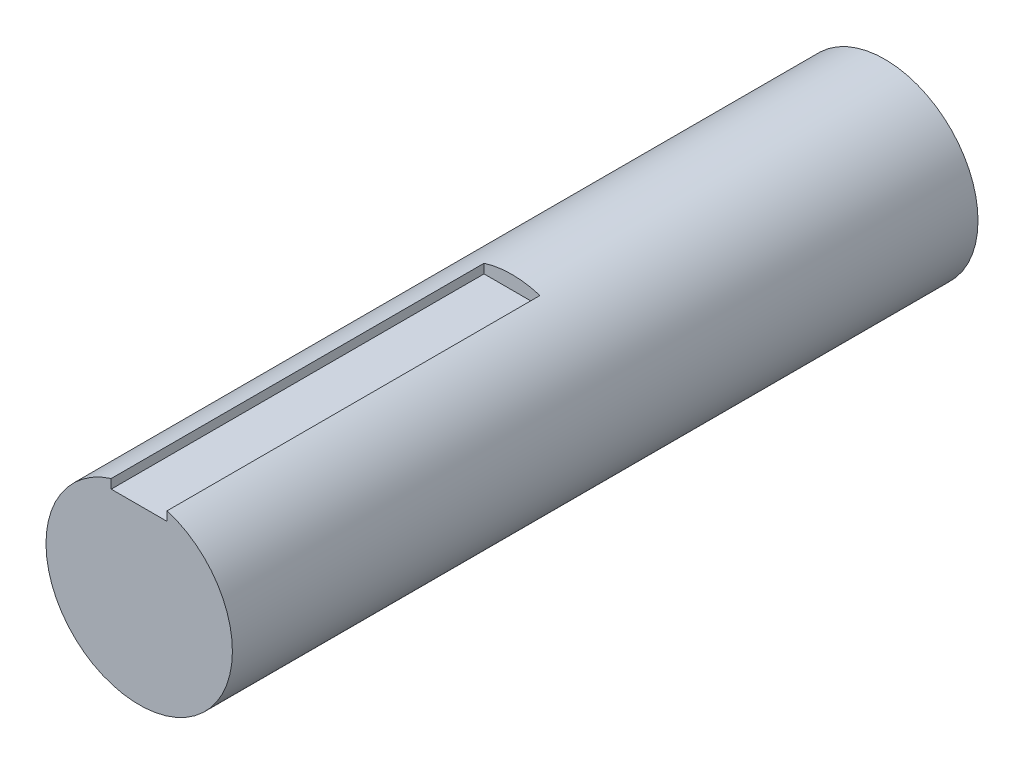
ISO-10303-21;
HEADER;
FILE_DESCRIPTION(('STEP AP214'),'2;1');
FILE_NAME('part.step','',(''),(''),'','','');
FILE_SCHEMA(('AUTOMOTIVE_DESIGN { 1 0 10303 214 1 1 1 1 }'));
ENDSEC;
DATA;
#1=APPLICATION_CONTEXT('core data for automotive mechanical design processes');
#2=APPLICATION_PROTOCOL_DEFINITION('international standard','automotive_design',2000,#1);
#3=PRODUCT_CONTEXT('',#1,'mechanical');
#4=PRODUCT('Part','Part','',(#3));
#5=PRODUCT_RELATED_PRODUCT_CATEGORY('part','',(#4));
#6=PRODUCT_DEFINITION_FORMATION('','',#4);
#7=PRODUCT_DEFINITION_CONTEXT('part definition',#1,'design');
#8=PRODUCT_DEFINITION('design','',#6,#7);
#9=PRODUCT_DEFINITION_SHAPE('','',#8);
#10=(LENGTH_UNIT() NAMED_UNIT(*) SI_UNIT(.MILLI.,.METRE.));
#11=(NAMED_UNIT(*) PLANE_ANGLE_UNIT() SI_UNIT($,.RADIAN.));
#12=(NAMED_UNIT(*) SI_UNIT($,.STERADIAN.) SOLID_ANGLE_UNIT());
#13=UNCERTAINTY_MEASURE_WITH_UNIT(LENGTH_MEASURE(1.E-05),#10,'distance_accuracy_value','');
#14=(GEOMETRIC_REPRESENTATION_CONTEXT(3) GLOBAL_UNCERTAINTY_ASSIGNED_CONTEXT((#13)) GLOBAL_UNIT_ASSIGNED_CONTEXT((#10,
#11,#12)) REPRESENTATION_CONTEXT('',''));
#15=CARTESIAN_POINT('',(0.,0.,0.));
#16=DIRECTION('',(0.,0.,1.));
#17=DIRECTION('',(1.,0.,0.));
#18=AXIS2_PLACEMENT_3D('',#15,#16,#17);
#19=CARTESIAN_POINT('',(0.,0.,20.));
#20=DIRECTION('',(0.,0.,-1.));
#21=DIRECTION('',(-1.,0.,0.));
#22=AXIS2_PLACEMENT_3D('',#19,#20,#21);
#23=CYLINDRICAL_SURFACE('',#22,2.5);
#24=CARTESIAN_POINT('',(0.,0.,20.));
#25=DIRECTION('',(0.,0.,1.));
#26=DIRECTION('',(1.,0.,0.));
#27=AXIS2_PLACEMENT_3D('',#24,#25,#26);
#28=CIRCLE('',#27,2.5);
#29=CARTESIAN_POINT('',(-0.75,2.38484800354236,20.));
#30=VERTEX_POINT('',#29);
#31=CARTESIAN_POINT('',(0.75,2.38484800354236,20.));
#32=VERTEX_POINT('',#31);
#33=EDGE_CURVE('E92',#30,#32,#28,.T.);
#34=ORIENTED_EDGE('',*,*,#33,.F.);
#35=DIRECTION('',(0.,0.,-1.));
#36=VECTOR('',#35,1.);
#37=CARTESIAN_POINT('',(-0.75,2.38484800354236,20.));
#38=LINE('',#37,#36);
#39=CARTESIAN_POINT('',(-0.75,2.38484800354236,10.));
#40=VERTEX_POINT('',#39);
#41=EDGE_CURVE('E102',#30,#40,#38,.T.);
#42=ORIENTED_EDGE('',*,*,#41,.T.);
#43=CARTESIAN_POINT('',(0.,0.,10.));
#44=DIRECTION('',(0.,0.,1.));
#45=DIRECTION('',(1.,0.,0.));
#46=AXIS2_PLACEMENT_3D('',#43,#44,#45);
#47=CIRCLE('',#46,2.5);
#48=CARTESIAN_POINT('',(0.75,2.38484800354236,10.));
#49=VERTEX_POINT('',#48);
#50=EDGE_CURVE('E11',#49,#40,#47,.T.);
#51=ORIENTED_EDGE('',*,*,#50,.F.);
#52=DIRECTION('',(0.,0.,-1.));
#53=VECTOR('',#52,1.);
#54=CARTESIAN_POINT('',(0.75,2.38484800354236,20.));
#55=LINE('',#54,#53);
#56=EDGE_CURVE('E81',#49,#32,#55,.F.);
#57=ORIENTED_EDGE('',*,*,#56,.T.);
#58=EDGE_LOOP('',(#34,#42,#51,#57));
#59=FACE_BOUND('',#58,.T.);
#60=CARTESIAN_POINT('',(0.,0.,0.));
#61=DIRECTION('',(0.,0.,1.));
#62=DIRECTION('',(1.,0.,0.));
#63=AXIS2_PLACEMENT_3D('',#60,#61,#62);
#64=CIRCLE('',#63,2.5);
#65=CARTESIAN_POINT('',(2.5,0.,0.));
#66=VERTEX_POINT('',#65);
#67=EDGE_CURVE('E105',#66,#66,#64,.T.);
#68=ORIENTED_EDGE('',*,*,#67,.T.);
#69=EDGE_LOOP('',(#68));
#70=FACE_BOUND('',#69,.T.);
#71=ADVANCED_FACE('F34',(#59,#70),#23,.T.);
#72=CARTESIAN_POINT('',(0.,0.,20.));
#73=DIRECTION('',(0.,0.,1.));
#74=DIRECTION('',(1.,0.,0.));
#75=AXIS2_PLACEMENT_3D('',#72,#73,#74);
#76=PLANE('',#75);
#77=DIRECTION('',(0.,-1.,0.));
#78=VECTOR('',#77,1.);
#79=CARTESIAN_POINT('',(-0.75,0.,20.));
#80=LINE('',#79,#78);
#81=CARTESIAN_POINT('',(-0.75,2.13698624242431,20.));
#82=VERTEX_POINT('',#81);
#83=EDGE_CURVE('E41',#30,#82,#80,.T.);
#84=ORIENTED_EDGE('',*,*,#83,.F.);
#85=ORIENTED_EDGE('',*,*,#33,.T.);
#86=DIRECTION('',(0.,1.,0.));
#87=VECTOR('',#86,1.);
#88=CARTESIAN_POINT('',(0.75,2.80501048484855,20.));
#89=LINE('',#88,#87);
#90=CARTESIAN_POINT('',(0.75,2.13698624242431,20.));
#91=VERTEX_POINT('',#90);
#92=EDGE_CURVE('E77',#91,#32,#89,.T.);
#93=ORIENTED_EDGE('',*,*,#92,.F.);
#94=DIRECTION('',(1.,0.,0.));
#95=VECTOR('',#94,1.);
#96=CARTESIAN_POINT('',(-0.75,2.13698624242431,20.));
#97=LINE('',#96,#95);
#98=EDGE_CURVE('E84',#82,#91,#97,.T.);
#99=ORIENTED_EDGE('',*,*,#98,.F.);
#100=EDGE_LOOP('',(#84,#85,#93,#99));
#101=FACE_BOUND('',#100,.T.);
#102=ADVANCED_FACE('F90',(#101),#76,.T.);
#103=CARTESIAN_POINT('',(0.,0.,0.));
#104=DIRECTION('',(0.,0.,1.));
#105=DIRECTION('',(1.,0.,0.));
#106=AXIS2_PLACEMENT_3D('',#103,#104,#105);
#107=PLANE('',#106);
#108=ORIENTED_EDGE('',*,*,#67,.F.);
#109=EDGE_LOOP('',(#108));
#110=FACE_BOUND('',#109,.T.);
#111=ADVANCED_FACE('F114',(#110),#107,.F.);
#112=CARTESIAN_POINT('',(-0.75,2.13698624242431,10.));
#113=DIRECTION('',(0.,0.,1.));
#114=DIRECTION('',(1.,0.,0.));
#115=AXIS2_PLACEMENT_3D('',#112,#113,#114);
#116=PLANE('',#115);
#117=ORIENTED_EDGE('',*,*,#50,.T.);
#118=DIRECTION('',(0.,-1.,0.));
#119=VECTOR('',#118,1.);
#120=CARTESIAN_POINT('',(-0.75,2.80501048484855,10.));
#121=LINE('',#120,#119);
#122=CARTESIAN_POINT('',(-0.75,2.13698624242431,10.));
#123=VERTEX_POINT('',#122);
#124=EDGE_CURVE('E93',#40,#123,#121,.T.);
#125=ORIENTED_EDGE('',*,*,#124,.T.);
#126=DIRECTION('',(1.,0.,0.));
#127=VECTOR('',#126,1.);
#128=CARTESIAN_POINT('',(-0.75,2.13698624242431,10.));
#129=LINE('',#128,#127);
#130=CARTESIAN_POINT('',(0.75,2.13698624242431,10.));
#131=VERTEX_POINT('',#130);
#132=EDGE_CURVE('E95',#123,#131,#129,.T.);
#133=ORIENTED_EDGE('',*,*,#132,.T.);
#134=DIRECTION('',(0.,1.,0.));
#135=VECTOR('',#134,1.);
#136=CARTESIAN_POINT('',(0.75,2.80501048484855,10.));
#137=LINE('',#136,#135);
#138=EDGE_CURVE('E79',#131,#49,#137,.T.);
#139=ORIENTED_EDGE('',*,*,#138,.T.);
#140=EDGE_LOOP('',(#117,#125,#133,#139));
#141=FACE_BOUND('',#140,.T.);
#142=ADVANCED_FACE('F112',(#141),#116,.T.);
#143=CARTESIAN_POINT('',(-0.75,2.80501048484855,10.));
#144=DIRECTION('',(-1.,0.,0.));
#145=DIRECTION('',(0.,-1.,0.));
#146=AXIS2_PLACEMENT_3D('',#143,#144,#145);
#147=PLANE('',#146);
#148=ORIENTED_EDGE('',*,*,#83,.T.);
#149=DIRECTION('',(0.,0.,1.));
#150=VECTOR('',#149,1.);
#151=CARTESIAN_POINT('',(-0.75,2.13698624242431,10.));
#152=LINE('',#151,#150);
#153=EDGE_CURVE('E48',#123,#82,#152,.T.);
#154=ORIENTED_EDGE('',*,*,#153,.F.);
#155=ORIENTED_EDGE('',*,*,#124,.F.);
#156=ORIENTED_EDGE('',*,*,#41,.F.);
#157=EDGE_LOOP('',(#148,#154,#155,#156));
#158=FACE_BOUND('',#157,.T.);
#159=ADVANCED_FACE('F109',(#158),#147,.F.);
#160=CARTESIAN_POINT('',(0.75,2.80501048484855,10.));
#161=DIRECTION('',(1.,0.,0.));
#162=DIRECTION('',(0.,1.,0.));
#163=AXIS2_PLACEMENT_3D('',#160,#161,#162);
#164=PLANE('',#163);
#165=ORIENTED_EDGE('',*,*,#138,.F.);
#166=DIRECTION('',(0.,0.,1.));
#167=VECTOR('',#166,1.);
#168=CARTESIAN_POINT('',(0.75,2.13698624242431,10.));
#169=LINE('',#168,#167);
#170=EDGE_CURVE('E74',#131,#91,#169,.T.);
#171=ORIENTED_EDGE('',*,*,#170,.T.);
#172=ORIENTED_EDGE('',*,*,#92,.T.);
#173=ORIENTED_EDGE('',*,*,#56,.F.);
#174=EDGE_LOOP('',(#165,#171,#172,#173));
#175=FACE_BOUND('',#174,.T.);
#176=ADVANCED_FACE('F75',(#175),#164,.F.);
#177=CARTESIAN_POINT('',(-0.75,2.13698624242431,10.));
#178=DIRECTION('',(0.,-1.,0.));
#179=DIRECTION('',(0.,0.,-1.));
#180=AXIS2_PLACEMENT_3D('',#177,#178,#179);
#181=PLANE('',#180);
#182=ORIENTED_EDGE('',*,*,#98,.T.);
#183=ORIENTED_EDGE('',*,*,#170,.F.);
#184=ORIENTED_EDGE('',*,*,#132,.F.);
#185=ORIENTED_EDGE('',*,*,#153,.T.);
#186=EDGE_LOOP('',(#182,#183,#184,#185));
#187=FACE_BOUND('',#186,.T.);
#188=ADVANCED_FACE('F85',(#187),#181,.F.);
#189=CLOSED_SHELL('',(#71,#102,#111,#142,#159,#176,#188));
#190=MANIFOLD_SOLID_BREP('B2',#189);
#191=ADVANCED_BREP_SHAPE_REPRESENTATION('',(#18,#190),#14);
#192=SHAPE_DEFINITION_REPRESENTATION(#9,#191);
ENDSEC;
END-ISO-10303-21;
